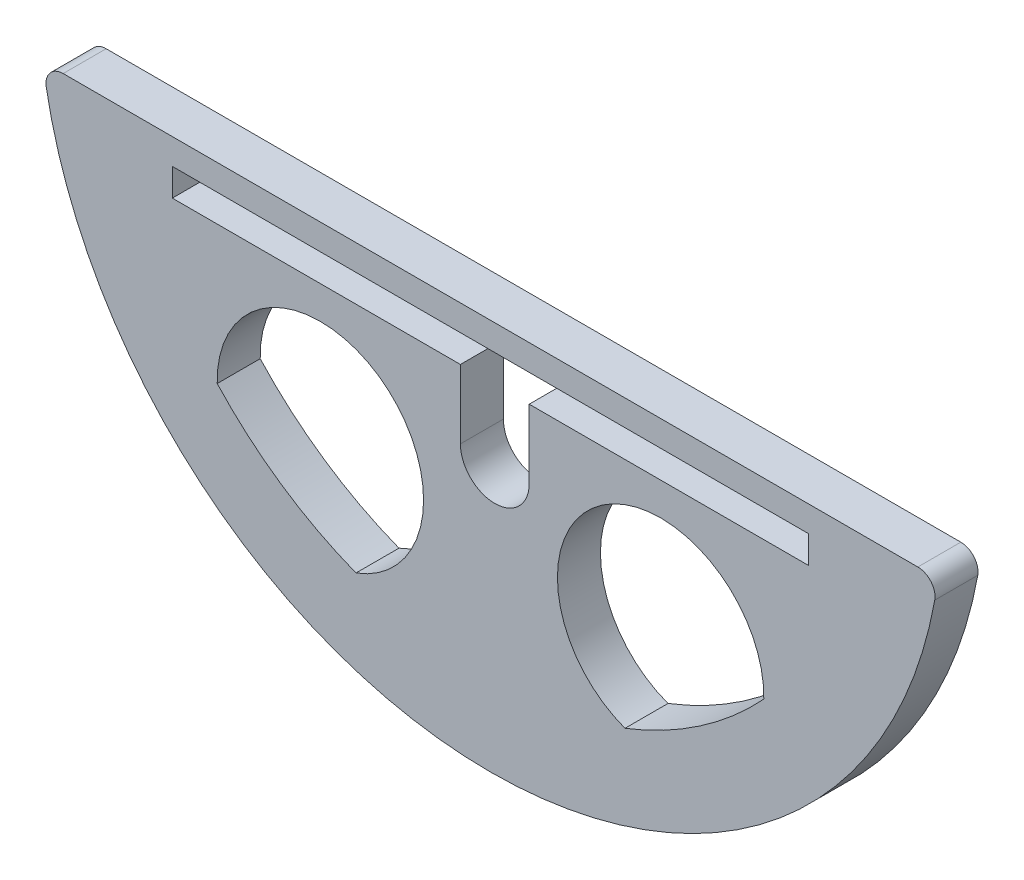
ISO-10303-21;
HEADER;
FILE_DESCRIPTION(('STEP AP214'),'2;1');
FILE_NAME('part.step','',(''),(''),'','','');
FILE_SCHEMA(('AUTOMOTIVE_DESIGN { 1 0 10303 214 1 1 1 1 }'));
ENDSEC;
DATA;
#1=APPLICATION_CONTEXT('core data for automotive mechanical design processes');
#2=APPLICATION_PROTOCOL_DEFINITION('international standard','automotive_design',2000,#1);
#3=PRODUCT_CONTEXT('',#1,'mechanical');
#4=PRODUCT('Part','Part','',(#3));
#5=PRODUCT_RELATED_PRODUCT_CATEGORY('part','',(#4));
#6=PRODUCT_DEFINITION_FORMATION('','',#4);
#7=PRODUCT_DEFINITION_CONTEXT('part definition',#1,'design');
#8=PRODUCT_DEFINITION('design','',#6,#7);
#9=PRODUCT_DEFINITION_SHAPE('','',#8);
#10=(LENGTH_UNIT() NAMED_UNIT(*) SI_UNIT(.MILLI.,.METRE.));
#11=(NAMED_UNIT(*) PLANE_ANGLE_UNIT() SI_UNIT($,.RADIAN.));
#12=(NAMED_UNIT(*) SI_UNIT($,.STERADIAN.) SOLID_ANGLE_UNIT());
#13=UNCERTAINTY_MEASURE_WITH_UNIT(LENGTH_MEASURE(1.E-05),#10,'distance_accuracy_value','');
#14=(GEOMETRIC_REPRESENTATION_CONTEXT(3) GLOBAL_UNCERTAINTY_ASSIGNED_CONTEXT((#13)) GLOBAL_UNIT_ASSIGNED_CONTEXT((#10,
#11,#12)) REPRESENTATION_CONTEXT('',''));
#15=CARTESIAN_POINT('',(0.,0.,0.));
#16=DIRECTION('',(0.,0.,1.));
#17=DIRECTION('',(1.,0.,0.));
#18=AXIS2_PLACEMENT_3D('',#15,#16,#17);
#19=CARTESIAN_POINT('',(0.,11.6,5.));
#20=DIRECTION('',(0.,0.,-1.));
#21=DIRECTION('',(-1.,0.,0.));
#22=AXIS2_PLACEMENT_3D('',#19,#20,#21);
#23=CYLINDRICAL_SURFACE('',#22,43.2);
#24=DIRECTION('',(0.,0.,-1.));
#25=VECTOR('',#24,1.);
#26=CARTESIAN_POINT('',(-31.7804046238222,-17.6616794108975,90.8848065725249));
#27=LINE('',#26,#25);
#28=CARTESIAN_POINT('',(-31.7804046238222,-17.6616794108975,5.));
#29=VERTEX_POINT('',#28);
#30=CARTESIAN_POINT('',(-31.7804046238222,-17.6616794108975,0.));
#31=VERTEX_POINT('',#30);
#32=EDGE_CURVE('E148',#29,#31,#27,.T.);
#33=ORIENTED_EDGE('',*,*,#32,.F.);
#34=CARTESIAN_POINT('',(0.,11.6,5.));
#35=DIRECTION('',(0.,0.,1.));
#36=DIRECTION('',(1.,0.,0.));
#37=AXIS2_PLACEMENT_3D('',#34,#35,#36);
#38=CIRCLE('',#37,43.2);
#39=CARTESIAN_POINT('',(-15.6405833241016,-28.6692457500986,5.));
#40=VERTEX_POINT('',#39);
#41=EDGE_CURVE('E159',#29,#40,#38,.T.);
#42=ORIENTED_EDGE('',*,*,#41,.T.);
#43=DIRECTION('',(0.,0.,-1.));
#44=VECTOR('',#43,1.);
#45=CARTESIAN_POINT('',(-15.6405833241016,-28.6692457500986,90.8848065725249));
#46=LINE('',#45,#44);
#47=CARTESIAN_POINT('',(-15.6405833241016,-28.6692457500986,0.));
#48=VERTEX_POINT('',#47);
#49=EDGE_CURVE('E151',#40,#48,#46,.T.);
#50=ORIENTED_EDGE('',*,*,#49,.T.);
#51=CARTESIAN_POINT('',(0.,11.6,0.));
#52=DIRECTION('',(0.,0.,1.));
#53=DIRECTION('',(1.,0.,0.));
#54=AXIS2_PLACEMENT_3D('',#51,#52,#53);
#55=CIRCLE('',#54,43.2);
#56=EDGE_CURVE('E161',#31,#48,#55,.T.);
#57=ORIENTED_EDGE('',*,*,#56,.F.);
#58=EDGE_LOOP('',(#33,#42,#50,#57));
#59=FACE_BOUND('',#58,.T.);
#60=ADVANCED_FACE('F34',(#59),#23,.F.);
#61=CARTESIAN_POINT('',(0.,11.6,5.));
#62=DIRECTION('',(0.,0.,-1.));
#63=DIRECTION('',(-1.,0.,0.));
#64=AXIS2_PLACEMENT_3D('',#61,#62,#63);
#65=CYLINDRICAL_SURFACE('',#64,43.2);
#66=CARTESIAN_POINT('',(0.,11.6,0.));
#67=DIRECTION('',(0.,0.,1.));
#68=DIRECTION('',(1.,0.,0.));
#69=AXIS2_PLACEMENT_3D('',#66,#67,#68);
#70=CIRCLE('',#69,43.2);
#71=CARTESIAN_POINT('',(15.6405833241016,-28.6692457500986,0.));
#72=VERTEX_POINT('',#71);
#73=CARTESIAN_POINT('',(31.7804046238222,-17.6616794108975,0.));
#74=VERTEX_POINT('',#73);
#75=EDGE_CURVE('E202',#72,#74,#70,.T.);
#76=ORIENTED_EDGE('',*,*,#75,.F.);
#77=DIRECTION('',(0.,0.,-1.));
#78=VECTOR('',#77,1.);
#79=CARTESIAN_POINT('',(15.6405833241016,-28.6692457500986,90.8848065725249));
#80=LINE('',#79,#78);
#81=CARTESIAN_POINT('',(15.6405833241016,-28.6692457500986,5.00000000000001));
#82=VERTEX_POINT('',#81);
#83=EDGE_CURVE('E56',#82,#72,#80,.T.);
#84=ORIENTED_EDGE('',*,*,#83,.F.);
#85=CARTESIAN_POINT('',(0.,11.6,5.));
#86=DIRECTION('',(0.,0.,1.));
#87=DIRECTION('',(1.,0.,0.));
#88=AXIS2_PLACEMENT_3D('',#85,#86,#87);
#89=CIRCLE('',#88,43.2);
#90=CARTESIAN_POINT('',(31.7804046238222,-17.6616794108975,5.));
#91=VERTEX_POINT('',#90);
#92=EDGE_CURVE('E51',#82,#91,#89,.T.);
#93=ORIENTED_EDGE('',*,*,#92,.T.);
#94=DIRECTION('',(0.,0.,-1.));
#95=VECTOR('',#94,1.);
#96=CARTESIAN_POINT('',(31.7804046238222,-17.6616794108975,90.8848065725249));
#97=LINE('',#96,#95);
#98=EDGE_CURVE('E155',#91,#74,#97,.T.);
#99=ORIENTED_EDGE('',*,*,#98,.T.);
#100=EDGE_LOOP('',(#76,#84,#93,#99));
#101=FACE_BOUND('',#100,.T.);
#102=ADVANCED_FACE('F36',(#101),#65,.F.);
#103=CARTESIAN_POINT('',(0.500000000000032,-9.59999999999999,5.));
#104=DIRECTION('',(0.,0.,-1.));
#105=DIRECTION('',(-1.,0.,0.));
#106=AXIS2_PLACEMENT_3D('',#103,#104,#105);
#107=CYLINDRICAL_SURFACE('',#106,4.);
#108=CARTESIAN_POINT('',(0.500000000000032,-9.59999999999999,0.));
#109=DIRECTION('',(0.,0.,1.));
#110=DIRECTION('',(1.,0.,0.));
#111=AXIS2_PLACEMENT_3D('',#108,#109,#110);
#112=CIRCLE('',#111,4.);
#113=CARTESIAN_POINT('',(-3.49999999999997,-9.59999999999999,0.));
#114=VERTEX_POINT('',#113);
#115=CARTESIAN_POINT('',(4.50000000000003,-9.59999999999999,0.));
#116=VERTEX_POINT('',#115);
#117=EDGE_CURVE('E219',#114,#116,#112,.T.);
#118=ORIENTED_EDGE('',*,*,#117,.F.);
#119=DIRECTION('',(0.,0.,-1.));
#120=VECTOR('',#119,1.);
#121=CARTESIAN_POINT('',(-3.49999999999997,-9.59999999999999,5.));
#122=LINE('',#121,#120);
#123=CARTESIAN_POINT('',(-3.49999999999997,-9.59999999999999,5.));
#124=VERTEX_POINT('',#123);
#125=EDGE_CURVE('E11',#124,#114,#122,.T.);
#126=ORIENTED_EDGE('',*,*,#125,.F.);
#127=CARTESIAN_POINT('',(0.500000000000032,-9.59999999999999,5.));
#128=DIRECTION('',(0.,0.,1.));
#129=DIRECTION('',(1.,0.,0.));
#130=AXIS2_PLACEMENT_3D('',#127,#128,#129);
#131=CIRCLE('',#130,4.);
#132=CARTESIAN_POINT('',(4.50000000000003,-9.59999999999999,5.));
#133=VERTEX_POINT('',#132);
#134=EDGE_CURVE('E181',#124,#133,#131,.T.);
#135=ORIENTED_EDGE('',*,*,#134,.T.);
#136=DIRECTION('',(0.,0.,-1.));
#137=VECTOR('',#136,1.);
#138=CARTESIAN_POINT('',(4.50000000000003,-9.59999999999999,5.));
#139=LINE('',#138,#137);
#140=EDGE_CURVE('E240',#133,#116,#139,.T.);
#141=ORIENTED_EDGE('',*,*,#140,.T.);
#142=EDGE_LOOP('',(#118,#126,#135,#141));
#143=FACE_BOUND('',#142,.T.);
#144=ADVANCED_FACE('F290',(#143),#107,.F.);
#145=CARTESIAN_POINT('',(-3.49999999999997,0.,5.));
#146=DIRECTION('',(-1.,0.,0.));
#147=DIRECTION('',(0.,0.,1.));
#148=AXIS2_PLACEMENT_3D('',#145,#146,#147);
#149=PLANE('',#148);
#150=DIRECTION('',(0.,1.,0.));
#151=VECTOR('',#150,1.);
#152=CARTESIAN_POINT('',(-3.49999999999997,0.,0.));
#153=LINE('',#152,#151);
#154=CARTESIAN_POINT('',(-3.49999999999997,-1.6,0.));
#155=VERTEX_POINT('',#154);
#156=EDGE_CURVE('E222',#114,#155,#153,.T.);
#157=ORIENTED_EDGE('',*,*,#156,.T.);
#158=DIRECTION('',(0.,0.,-1.));
#159=VECTOR('',#158,1.);
#160=CARTESIAN_POINT('',(-3.49999999999997,-1.6,5.));
#161=LINE('',#160,#159);
#162=CARTESIAN_POINT('',(-3.49999999999997,-1.6,5.));
#163=VERTEX_POINT('',#162);
#164=EDGE_CURVE('E43',#163,#155,#161,.T.);
#165=ORIENTED_EDGE('',*,*,#164,.F.);
#166=DIRECTION('',(0.,1.,0.));
#167=VECTOR('',#166,1.);
#168=CARTESIAN_POINT('',(-3.49999999999997,0.,5.));
#169=LINE('',#168,#167);
#170=EDGE_CURVE('E184',#124,#163,#169,.T.);
#171=ORIENTED_EDGE('',*,*,#170,.F.);
#172=ORIENTED_EDGE('',*,*,#125,.T.);
#173=EDGE_LOOP('',(#157,#165,#171,#172));
#174=FACE_BOUND('',#173,.T.);
#175=ADVANCED_FACE('F311',(#174),#149,.F.);
#176=CARTESIAN_POINT('',(0.,-1.6,5.));
#177=DIRECTION('',(0.,1.,0.));
#178=DIRECTION('',(0.,0.,1.));
#179=AXIS2_PLACEMENT_3D('',#176,#177,#178);
#180=PLANE('',#179);
#181=DIRECTION('',(1.,0.,0.));
#182=VECTOR('',#181,1.);
#183=CARTESIAN_POINT('',(0.,-1.6,0.));
#184=LINE('',#183,#182);
#185=CARTESIAN_POINT('',(-37.,-1.6,0.));
#186=VERTEX_POINT('',#185);
#187=EDGE_CURVE('E225',#186,#155,#184,.T.);
#188=ORIENTED_EDGE('',*,*,#187,.F.);
#189=DIRECTION('',(0.,0.,-1.));
#190=VECTOR('',#189,1.);
#191=CARTESIAN_POINT('',(-37.,-1.6,5.));
#192=LINE('',#191,#190);
#193=CARTESIAN_POINT('',(-37.,-1.6,5.));
#194=VERTEX_POINT('',#193);
#195=EDGE_CURVE('E251',#194,#186,#192,.T.);
#196=ORIENTED_EDGE('',*,*,#195,.F.);
#197=DIRECTION('',(1.,0.,0.));
#198=VECTOR('',#197,1.);
#199=CARTESIAN_POINT('',(0.,-1.6,5.));
#200=LINE('',#199,#198);
#201=EDGE_CURVE('E186',#194,#163,#200,.T.);
#202=ORIENTED_EDGE('',*,*,#201,.T.);
#203=ORIENTED_EDGE('',*,*,#164,.T.);
#204=EDGE_LOOP('',(#188,#196,#202,#203));
#205=FACE_BOUND('',#204,.T.);
#206=ADVANCED_FACE('F300',(#205),#180,.T.);
#207=CARTESIAN_POINT('',(-37.,0.,5.));
#208=DIRECTION('',(-1.,0.,0.));
#209=DIRECTION('',(0.,0.,1.));
#210=AXIS2_PLACEMENT_3D('',#207,#208,#209);
#211=PLANE('',#210);
#212=DIRECTION('',(0.,1.,0.));
#213=VECTOR('',#212,1.);
#214=CARTESIAN_POINT('',(-37.,0.,0.));
#215=LINE('',#214,#213);
#216=CARTESIAN_POINT('',(-37.,1.6,0.));
#217=VERTEX_POINT('',#216);
#218=EDGE_CURVE('E228',#186,#217,#215,.T.);
#219=ORIENTED_EDGE('',*,*,#218,.T.);
#220=DIRECTION('',(0.,0.,-1.));
#221=VECTOR('',#220,1.);
#222=CARTESIAN_POINT('',(-37.,1.6,5.));
#223=LINE('',#222,#221);
#224=CARTESIAN_POINT('',(-37.,1.6,5.));
#225=VERTEX_POINT('',#224);
#226=EDGE_CURVE('E248',#225,#217,#223,.T.);
#227=ORIENTED_EDGE('',*,*,#226,.F.);
#228=DIRECTION('',(0.,1.,0.));
#229=VECTOR('',#228,1.);
#230=CARTESIAN_POINT('',(-37.,0.,5.));
#231=LINE('',#230,#229);
#232=EDGE_CURVE('E189',#194,#225,#231,.T.);
#233=ORIENTED_EDGE('',*,*,#232,.F.);
#234=ORIENTED_EDGE('',*,*,#195,.T.);
#235=EDGE_LOOP('',(#219,#227,#233,#234));
#236=FACE_BOUND('',#235,.T.);
#237=ADVANCED_FACE('F310',(#236),#211,.F.);
#238=CARTESIAN_POINT('',(0.,1.6,5.));
#239=DIRECTION('',(0.,1.,0.));
#240=DIRECTION('',(0.,0.,1.));
#241=AXIS2_PLACEMENT_3D('',#238,#239,#240);
#242=PLANE('',#241);
#243=DIRECTION('',(1.,0.,0.));
#244=VECTOR('',#243,1.);
#245=CARTESIAN_POINT('',(0.,1.6,0.));
#246=LINE('',#245,#244);
#247=CARTESIAN_POINT('',(37.,1.6,0.));
#248=VERTEX_POINT('',#247);
#249=EDGE_CURVE('E232',#217,#248,#246,.T.);
#250=ORIENTED_EDGE('',*,*,#249,.T.);
#251=DIRECTION('',(0.,0.,-1.));
#252=VECTOR('',#251,1.);
#253=CARTESIAN_POINT('',(37.,1.6,5.));
#254=LINE('',#253,#252);
#255=CARTESIAN_POINT('',(37.,1.6,5.));
#256=VERTEX_POINT('',#255);
#257=EDGE_CURVE('E246',#256,#248,#254,.T.);
#258=ORIENTED_EDGE('',*,*,#257,.F.);
#259=DIRECTION('',(1.,0.,0.));
#260=VECTOR('',#259,1.);
#261=CARTESIAN_POINT('',(0.,1.6,5.));
#262=LINE('',#261,#260);
#263=EDGE_CURVE('E193',#225,#256,#262,.T.);
#264=ORIENTED_EDGE('',*,*,#263,.F.);
#265=ORIENTED_EDGE('',*,*,#226,.T.);
#266=EDGE_LOOP('',(#250,#258,#264,#265));
#267=FACE_BOUND('',#266,.T.);
#268=ADVANCED_FACE('F304',(#267),#242,.F.);
#269=CARTESIAN_POINT('',(37.,0.,5.));
#270=DIRECTION('',(-1.,0.,0.));
#271=DIRECTION('',(0.,0.,1.));
#272=AXIS2_PLACEMENT_3D('',#269,#270,#271);
#273=PLANE('',#272);
#274=DIRECTION('',(0.,1.,0.));
#275=VECTOR('',#274,1.);
#276=CARTESIAN_POINT('',(37.,0.,0.));
#277=LINE('',#276,#275);
#278=CARTESIAN_POINT('',(37.,-1.6,0.));
#279=VERTEX_POINT('',#278);
#280=EDGE_CURVE('E235',#279,#248,#277,.T.);
#281=ORIENTED_EDGE('',*,*,#280,.F.);
#282=DIRECTION('',(0.,0.,-1.));
#283=VECTOR('',#282,1.);
#284=CARTESIAN_POINT('',(37.,-1.6,5.));
#285=LINE('',#284,#283);
#286=CARTESIAN_POINT('',(37.,-1.6,5.));
#287=VERTEX_POINT('',#286);
#288=EDGE_CURVE('E244',#287,#279,#285,.T.);
#289=ORIENTED_EDGE('',*,*,#288,.F.);
#290=DIRECTION('',(0.,1.,0.));
#291=VECTOR('',#290,1.);
#292=CARTESIAN_POINT('',(37.,0.,5.));
#293=LINE('',#292,#291);
#294=EDGE_CURVE('E195',#287,#256,#293,.T.);
#295=ORIENTED_EDGE('',*,*,#294,.T.);
#296=ORIENTED_EDGE('',*,*,#257,.T.);
#297=EDGE_LOOP('',(#281,#289,#295,#296));
#298=FACE_BOUND('',#297,.T.);
#299=ADVANCED_FACE('F297',(#298),#273,.T.);
#300=CARTESIAN_POINT('',(4.50000000000003,-1.6,0.));
#301=VERTEX_POINT('',#300);
#302=EDGE_CURVE('E229',#301,#279,#184,.T.);
#303=ORIENTED_EDGE('',*,*,#302,.F.);
#304=DIRECTION('',(0.,0.,-1.));
#305=VECTOR('',#304,1.);
#306=CARTESIAN_POINT('',(4.50000000000003,-1.6,5.));
#307=LINE('',#306,#305);
#308=CARTESIAN_POINT('',(4.50000000000003,-1.6,5.));
#309=VERTEX_POINT('',#308);
#310=EDGE_CURVE('E242',#309,#301,#307,.T.);
#311=ORIENTED_EDGE('',*,*,#310,.F.);
#312=EDGE_CURVE('E190',#309,#287,#200,.T.);
#313=ORIENTED_EDGE('',*,*,#312,.T.);
#314=ORIENTED_EDGE('',*,*,#288,.T.);
#315=EDGE_LOOP('',(#303,#311,#313,#314));
#316=FACE_BOUND('',#315,.T.);
#317=ADVANCED_FACE('F293',(#316),#180,.T.);
#318=CARTESIAN_POINT('',(0.,4.6,5.));
#319=DIRECTION('',(0.,1.,0.));
#320=DIRECTION('',(0.,0.,1.));
#321=AXIS2_PLACEMENT_3D('',#318,#319,#320);
#322=PLANE('',#321);
#323=DIRECTION('',(1.,0.,0.));
#324=VECTOR('',#323,1.);
#325=CARTESIAN_POINT('',(0.,4.6,0.));
#326=LINE('',#325,#324);
#327=CARTESIAN_POINT('',(-49.6915485771977,4.6,0.));
#328=VERTEX_POINT('',#327);
#329=CARTESIAN_POINT('',(49.6915485771977,4.6,0.));
#330=VERTEX_POINT('',#329);
#331=EDGE_CURVE('E207',#328,#330,#326,.T.);
#332=ORIENTED_EDGE('',*,*,#331,.F.);
#333=DIRECTION('',(0.,0.,-1.));
#334=VECTOR('',#333,1.);
#335=CARTESIAN_POINT('',(-49.6915485771977,4.6,5.));
#336=LINE('',#335,#334);
#337=CARTESIAN_POINT('',(-49.6915485771977,4.6,5.));
#338=VERTEX_POINT('',#337);
#339=EDGE_CURVE('E38',#338,#328,#336,.T.);
#340=ORIENTED_EDGE('',*,*,#339,.F.);
#341=DIRECTION('',(1.,0.,0.));
#342=VECTOR('',#341,1.);
#343=CARTESIAN_POINT('',(0.,4.6,5.));
#344=LINE('',#343,#342);
#345=CARTESIAN_POINT('',(49.6915485771977,4.6,5.));
#346=VERTEX_POINT('',#345);
#347=EDGE_CURVE('E165',#338,#346,#344,.T.);
#348=ORIENTED_EDGE('',*,*,#347,.T.);
#349=DIRECTION('',(0.,0.,-1.));
#350=VECTOR('',#349,1.);
#351=CARTESIAN_POINT('',(49.6915485771977,4.6,5.));
#352=LINE('',#351,#350);
#353=EDGE_CURVE('E201',#346,#330,#352,.T.);
#354=ORIENTED_EDGE('',*,*,#353,.T.);
#355=EDGE_LOOP('',(#332,#340,#348,#354));
#356=FACE_BOUND('',#355,.T.);
#357=ADVANCED_FACE('F271',(#356),#322,.T.);
#358=CARTESIAN_POINT('',(-49.6915485771977,2.6,5.));
#359=DIRECTION('',(0.,0.,-1.));
#360=DIRECTION('',(-1.,0.,0.));
#361=AXIS2_PLACEMENT_3D('',#358,#359,#360);
#362=CYLINDRICAL_SURFACE('',#361,2.);
#363=CARTESIAN_POINT('',(-49.6915485771977,2.6,0.));
#364=DIRECTION('',(0.,0.,1.));
#365=DIRECTION('',(1.,0.,0.));
#366=AXIS2_PLACEMENT_3D('',#363,#364,#365);
#367=CIRCLE('',#366,2.);
#368=CARTESIAN_POINT('',(-51.6595306990669,2.24356435643566,0.));
#369=VERTEX_POINT('',#368);
#370=EDGE_CURVE('E210',#328,#369,#367,.T.);
#371=ORIENTED_EDGE('',*,*,#370,.T.);
#372=DIRECTION('',(0.,0.,-1.));
#373=VECTOR('',#372,1.);
#374=CARTESIAN_POINT('',(-51.6595306990669,2.24356435643566,5.));
#375=LINE('',#374,#373);
#376=CARTESIAN_POINT('',(-51.6595306990669,2.24356435643566,5.));
#377=VERTEX_POINT('',#376);
#378=EDGE_CURVE('E257',#377,#369,#375,.T.);
#379=ORIENTED_EDGE('',*,*,#378,.F.);
#380=CARTESIAN_POINT('',(-49.6915485771977,2.6,5.));
#381=DIRECTION('',(0.,0.,1.));
#382=DIRECTION('',(1.,0.,0.));
#383=AXIS2_PLACEMENT_3D('',#380,#381,#382);
#384=CIRCLE('',#383,2.);
#385=EDGE_CURVE('E168',#338,#377,#384,.T.);
#386=ORIENTED_EDGE('',*,*,#385,.F.);
#387=ORIENTED_EDGE('',*,*,#339,.T.);
#388=EDGE_LOOP('',(#371,#379,#386,#387));
#389=FACE_BOUND('',#388,.T.);
#390=ADVANCED_FACE('F264',(#389),#362,.T.);
#391=CARTESIAN_POINT('',(0.,11.6,5.));
#392=DIRECTION('',(0.,0.,-1.));
#393=DIRECTION('',(-1.,0.,0.));
#394=AXIS2_PLACEMENT_3D('',#391,#392,#393);
#395=CYLINDRICAL_SURFACE('',#394,52.5);
#396=CARTESIAN_POINT('',(0.,11.6,0.));
#397=DIRECTION('',(0.,0.,1.));
#398=DIRECTION('',(1.,0.,0.));
#399=AXIS2_PLACEMENT_3D('',#396,#397,#398);
#400=CIRCLE('',#399,52.5);
#401=CARTESIAN_POINT('',(51.6595306990669,2.24356435643564,0.));
#402=VERTEX_POINT('',#401);
#403=EDGE_CURVE('E213',#369,#402,#400,.T.);
#404=ORIENTED_EDGE('',*,*,#403,.T.);
#405=DIRECTION('',(0.,0.,-1.));
#406=VECTOR('',#405,1.);
#407=CARTESIAN_POINT('',(51.6595306990669,2.24356435643564,5.));
#408=LINE('',#407,#406);
#409=CARTESIAN_POINT('',(51.6595306990669,2.24356435643564,5.));
#410=VERTEX_POINT('',#409);
#411=EDGE_CURVE('E255',#410,#402,#408,.T.);
#412=ORIENTED_EDGE('',*,*,#411,.F.);
#413=CARTESIAN_POINT('',(0.,11.6,5.));
#414=DIRECTION('',(0.,0.,1.));
#415=DIRECTION('',(1.,0.,0.));
#416=AXIS2_PLACEMENT_3D('',#413,#414,#415);
#417=CIRCLE('',#416,52.5);
#418=EDGE_CURVE('E176',#377,#410,#417,.T.);
#419=ORIENTED_EDGE('',*,*,#418,.F.);
#420=ORIENTED_EDGE('',*,*,#378,.T.);
#421=EDGE_LOOP('',(#404,#412,#419,#420));
#422=FACE_BOUND('',#421,.T.);
#423=ADVANCED_FACE('F276',(#422),#395,.T.);
#424=CARTESIAN_POINT('',(49.6915485771977,2.6,5.));
#425=DIRECTION('',(0.,0.,-1.));
#426=DIRECTION('',(-1.,0.,0.));
#427=AXIS2_PLACEMENT_3D('',#424,#425,#426);
#428=CYLINDRICAL_SURFACE('',#427,2.);
#429=CARTESIAN_POINT('',(49.6915485771977,2.6,0.));
#430=DIRECTION('',(0.,0.,1.));
#431=DIRECTION('',(1.,0.,0.));
#432=AXIS2_PLACEMENT_3D('',#429,#430,#431);
#433=CIRCLE('',#432,2.);
#434=EDGE_CURVE('E216',#402,#330,#433,.T.);
#435=ORIENTED_EDGE('',*,*,#434,.T.);
#436=ORIENTED_EDGE('',*,*,#353,.F.);
#437=CARTESIAN_POINT('',(49.6915485771977,2.6,5.));
#438=DIRECTION('',(0.,0.,1.));
#439=DIRECTION('',(1.,0.,0.));
#440=AXIS2_PLACEMENT_3D('',#437,#438,#439);
#441=CIRCLE('',#440,2.);
#442=EDGE_CURVE('E179',#410,#346,#441,.T.);
#443=ORIENTED_EDGE('',*,*,#442,.F.);
#444=ORIENTED_EDGE('',*,*,#411,.T.);
#445=EDGE_LOOP('',(#435,#436,#443,#444));
#446=FACE_BOUND('',#445,.T.);
#447=ADVANCED_FACE('F274',(#446),#428,.T.);
#448=CARTESIAN_POINT('',(4.50000000000003,0.,5.));
#449=DIRECTION('',(-1.,0.,0.));
#450=DIRECTION('',(0.,0.,1.));
#451=AXIS2_PLACEMENT_3D('',#448,#449,#450);
#452=PLANE('',#451);
#453=DIRECTION('',(0.,1.,0.));
#454=VECTOR('',#453,1.);
#455=CARTESIAN_POINT('',(4.50000000000003,0.,0.));
#456=LINE('',#455,#454);
#457=EDGE_CURVE('E170',#116,#301,#456,.T.);
#458=ORIENTED_EDGE('',*,*,#457,.F.);
#459=ORIENTED_EDGE('',*,*,#140,.F.);
#460=DIRECTION('',(0.,1.,0.));
#461=VECTOR('',#460,1.);
#462=CARTESIAN_POINT('',(4.50000000000003,0.,5.));
#463=LINE('',#462,#461);
#464=EDGE_CURVE('E198',#133,#309,#463,.T.);
#465=ORIENTED_EDGE('',*,*,#464,.T.);
#466=ORIENTED_EDGE('',*,*,#310,.T.);
#467=EDGE_LOOP('',(#458,#459,#465,#466));
#468=FACE_BOUND('',#467,.T.);
#469=ADVANCED_FACE('F283',(#468),#452,.T.);
#470=CARTESIAN_POINT('',(0.,0.,5.));
#471=DIRECTION('',(0.,0.,1.));
#472=DIRECTION('',(1.,0.,0.));
#473=AXIS2_PLACEMENT_3D('',#470,#471,#472);
#474=PLANE('',#473);
#475=ORIENTED_EDGE('',*,*,#92,.F.);
#476=CARTESIAN_POINT('',(19.7831087240423,-17.4069421087095,5.));
#477=DIRECTION('',(0.,0.,1.));
#478=DIRECTION('',(1.,0.,0.));
#479=AXIS2_PLACEMENT_3D('',#476,#477,#478);
#480=CIRCLE('',#479,12.);
#481=EDGE_CURVE('E205',#82,#91,#480,.F.);
#482=ORIENTED_EDGE('',*,*,#481,.T.);
#483=EDGE_LOOP('',(#475,#482));
#484=FACE_BOUND('',#483,.T.);
#485=ORIENTED_EDGE('',*,*,#41,.F.);
#486=CARTESIAN_POINT('',(-19.7831087240423,-17.4069421087095,5.));
#487=DIRECTION('',(0.,0.,1.));
#488=DIRECTION('',(1.,0.,0.));
#489=AXIS2_PLACEMENT_3D('',#486,#487,#488);
#490=CIRCLE('',#489,12.);
#491=EDGE_CURVE('E145',#40,#29,#490,.T.);
#492=ORIENTED_EDGE('',*,*,#491,.F.);
#493=EDGE_LOOP('',(#485,#492));
#494=FACE_BOUND('',#493,.T.);
#495=ORIENTED_EDGE('',*,*,#347,.F.);
#496=ORIENTED_EDGE('',*,*,#385,.T.);
#497=ORIENTED_EDGE('',*,*,#418,.T.);
#498=ORIENTED_EDGE('',*,*,#442,.T.);
#499=EDGE_LOOP('',(#495,#496,#497,#498));
#500=FACE_BOUND('',#499,.T.);
#501=ORIENTED_EDGE('',*,*,#134,.F.);
#502=ORIENTED_EDGE('',*,*,#170,.T.);
#503=ORIENTED_EDGE('',*,*,#201,.F.);
#504=ORIENTED_EDGE('',*,*,#232,.T.);
#505=ORIENTED_EDGE('',*,*,#263,.T.);
#506=ORIENTED_EDGE('',*,*,#294,.F.);
#507=ORIENTED_EDGE('',*,*,#312,.F.);
#508=ORIENTED_EDGE('',*,*,#464,.F.);
#509=EDGE_LOOP('',(#501,#502,#503,#504,#505,#506,#507,#508));
#510=FACE_BOUND('',#509,.T.);
#511=ADVANCED_FACE('F163',(#484,#494,#500,#510),#474,.T.);
#512=CARTESIAN_POINT('',(0.,0.,0.));
#513=DIRECTION('',(0.,0.,1.));
#514=DIRECTION('',(1.,0.,0.));
#515=AXIS2_PLACEMENT_3D('',#512,#513,#514);
#516=PLANE('',#515);
#517=CARTESIAN_POINT('',(19.7831087240423,-17.4069421087095,0.));
#518=DIRECTION('',(0.,0.,1.));
#519=DIRECTION('',(1.,0.,0.));
#520=AXIS2_PLACEMENT_3D('',#517,#518,#519);
#521=CIRCLE('',#520,12.);
#522=EDGE_CURVE('E470',#72,#74,#521,.F.);
#523=ORIENTED_EDGE('',*,*,#522,.F.);
#524=ORIENTED_EDGE('',*,*,#75,.T.);
#525=EDGE_LOOP('',(#523,#524));
#526=FACE_BOUND('',#525,.T.);
#527=CARTESIAN_POINT('',(-19.7831087240423,-17.4069421087095,0.));
#528=DIRECTION('',(0.,0.,1.));
#529=DIRECTION('',(1.,0.,0.));
#530=AXIS2_PLACEMENT_3D('',#527,#528,#529);
#531=CIRCLE('',#530,12.);
#532=EDGE_CURVE('E464',#48,#31,#531,.T.);
#533=ORIENTED_EDGE('',*,*,#532,.T.);
#534=ORIENTED_EDGE('',*,*,#56,.T.);
#535=EDGE_LOOP('',(#533,#534));
#536=FACE_BOUND('',#535,.T.);
#537=ORIENTED_EDGE('',*,*,#331,.T.);
#538=ORIENTED_EDGE('',*,*,#434,.F.);
#539=ORIENTED_EDGE('',*,*,#403,.F.);
#540=ORIENTED_EDGE('',*,*,#370,.F.);
#541=EDGE_LOOP('',(#537,#538,#539,#540));
#542=FACE_BOUND('',#541,.T.);
#543=ORIENTED_EDGE('',*,*,#117,.T.);
#544=ORIENTED_EDGE('',*,*,#457,.T.);
#545=ORIENTED_EDGE('',*,*,#302,.T.);
#546=ORIENTED_EDGE('',*,*,#280,.T.);
#547=ORIENTED_EDGE('',*,*,#249,.F.);
#548=ORIENTED_EDGE('',*,*,#218,.F.);
#549=ORIENTED_EDGE('',*,*,#187,.T.);
#550=ORIENTED_EDGE('',*,*,#156,.F.);
#551=EDGE_LOOP('',(#543,#544,#545,#546,#547,#548,#549,#550));
#552=FACE_BOUND('',#551,.T.);
#553=ADVANCED_FACE('F269',(#526,#536,#542,#552),#516,.F.);
#554=CARTESIAN_POINT('',(-19.7831087240423,-17.4069421087095,90.8848065725249));
#555=DIRECTION('',(0.,0.,-1.));
#556=DIRECTION('',(-1.,0.,0.));
#557=AXIS2_PLACEMENT_3D('',#554,#555,#556);
#558=CYLINDRICAL_SURFACE('',#557,12.);
#559=ORIENTED_EDGE('',*,*,#49,.F.);
#560=ORIENTED_EDGE('',*,*,#491,.T.);
#561=ORIENTED_EDGE('',*,*,#32,.T.);
#562=ORIENTED_EDGE('',*,*,#532,.F.);
#563=EDGE_LOOP('',(#559,#560,#561,#562));
#564=FACE_BOUND('',#563,.T.);
#565=ADVANCED_FACE('F147',(#564),#558,.F.);
#566=CARTESIAN_POINT('',(19.7831087240423,-17.4069421087095,90.8848065725249));
#567=DIRECTION('',(0.,0.,-1.));
#568=DIRECTION('',(-1.,0.,0.));
#569=AXIS2_PLACEMENT_3D('',#566,#567,#568);
#570=CYLINDRICAL_SURFACE('',#569,12.);
#571=ORIENTED_EDGE('',*,*,#481,.F.);
#572=ORIENTED_EDGE('',*,*,#83,.T.);
#573=ORIENTED_EDGE('',*,*,#522,.T.);
#574=ORIENTED_EDGE('',*,*,#98,.F.);
#575=EDGE_LOOP('',(#571,#572,#573,#574));
#576=FACE_BOUND('',#575,.T.);
#577=ADVANCED_FACE('F447',(#576),#570,.F.);
#578=CLOSED_SHELL('',(#60,#102,#144,#175,#206,#237,#268,#299,#317,#357,#390,#423,#447,#469,#511,
#553,#565,#577));
#579=MANIFOLD_SOLID_BREP('B2',#578);
#580=ADVANCED_BREP_SHAPE_REPRESENTATION('',(#18,#579),#14);
#581=SHAPE_DEFINITION_REPRESENTATION(#9,#580);
ENDSEC;
END-ISO-10303-21;
